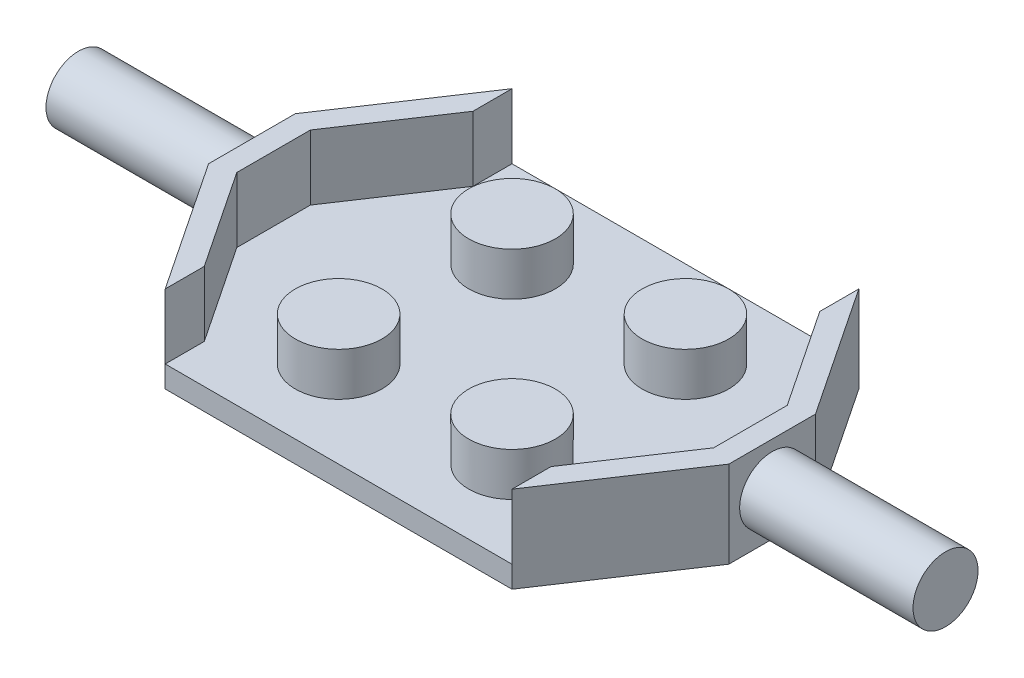
ISO-10303-21;
HEADER;
FILE_DESCRIPTION(('STEP AP214'),'2;1');
FILE_NAME('part.step','',(''),(''),'','','');
FILE_SCHEMA(('AUTOMOTIVE_DESIGN { 1 0 10303 214 1 1 1 1 }'));
ENDSEC;
DATA;
#1=APPLICATION_CONTEXT('core data for automotive mechanical design processes');
#2=APPLICATION_PROTOCOL_DEFINITION('international standard','automotive_design',2000,#1);
#3=PRODUCT_CONTEXT('',#1,'mechanical');
#4=PRODUCT('Part','Part','',(#3));
#5=PRODUCT_RELATED_PRODUCT_CATEGORY('part','',(#4));
#6=PRODUCT_DEFINITION_FORMATION('','',#4);
#7=PRODUCT_DEFINITION_CONTEXT('part definition',#1,'design');
#8=PRODUCT_DEFINITION('design','',#6,#7);
#9=PRODUCT_DEFINITION_SHAPE('','',#8);
#10=(LENGTH_UNIT() NAMED_UNIT(*) SI_UNIT(.MILLI.,.METRE.));
#11=(NAMED_UNIT(*) PLANE_ANGLE_UNIT() SI_UNIT($,.RADIAN.));
#12=(NAMED_UNIT(*) SI_UNIT($,.STERADIAN.) SOLID_ANGLE_UNIT());
#13=UNCERTAINTY_MEASURE_WITH_UNIT(LENGTH_MEASURE(1.E-05),#10,'distance_accuracy_value','');
#14=(GEOMETRIC_REPRESENTATION_CONTEXT(3) GLOBAL_UNCERTAINTY_ASSIGNED_CONTEXT((#13)) GLOBAL_UNIT_ASSIGNED_CONTEXT((#10,
#11,#12)) REPRESENTATION_CONTEXT('',''));
#15=CARTESIAN_POINT('',(0.,0.,0.));
#16=DIRECTION('',(0.,0.,1.));
#17=DIRECTION('',(1.,0.,0.));
#18=AXIS2_PLACEMENT_3D('',#15,#16,#17);
#19=CARTESIAN_POINT('',(0.,1.,0.));
#20=DIRECTION('',(0.,1.,0.));
#21=DIRECTION('',(0.,0.,1.));
#22=AXIS2_PLACEMENT_3D('',#19,#20,#21);
#23=PLANE('',#22);
#24=DIRECTION('',(0.,0.,-1.));
#25=VECTOR('',#24,1.);
#26=CARTESIAN_POINT('',(8.,1.,-8.));
#27=LINE('',#26,#25);
#28=CARTESIAN_POINT('',(8.,1.,-6.19722436226801));
#29=VERTEX_POINT('',#28);
#30=CARTESIAN_POINT('',(8.,1.,-8.));
#31=VERTEX_POINT('',#30);
#32=EDGE_CURVE('E389',#29,#31,#27,.T.);
#33=ORIENTED_EDGE('',*,*,#32,.T.);
#34=DIRECTION('',(1.,0.,0.));
#35=VECTOR('',#34,1.);
#36=CARTESIAN_POINT('',(0.,1.,-8.));
#37=LINE('',#36,#35);
#38=CARTESIAN_POINT('',(-8.,1.,-8.));
#39=VERTEX_POINT('',#38);
#40=EDGE_CURVE('E103',#39,#31,#37,.T.);
#41=ORIENTED_EDGE('',*,*,#40,.F.);
#42=DIRECTION('',(0.,0.,-1.));
#43=VECTOR('',#42,1.);
#44=CARTESIAN_POINT('',(-8.,1.,-8.));
#45=LINE('',#44,#43);
#46=CARTESIAN_POINT('',(-8.,1.,-6.19722436226801));
#47=VERTEX_POINT('',#46);
#48=EDGE_CURVE('E127',#47,#39,#45,.T.);
#49=ORIENTED_EDGE('',*,*,#48,.F.);
#50=DIRECTION('',(0.554700196225228,0.,-0.832050294337844));
#51=VECTOR('',#50,1.);
#52=CARTESIAN_POINT('',(-11.,1.,-1.697224362268));
#53=LINE('',#52,#51);
#54=CARTESIAN_POINT('',(-11.,1.,-1.697224362268));
#55=VERTEX_POINT('',#54);
#56=EDGE_CURVE('E157',#55,#47,#53,.T.);
#57=ORIENTED_EDGE('',*,*,#56,.F.);
#58=DIRECTION('',(0.,0.,-1.));
#59=VECTOR('',#58,1.);
#60=CARTESIAN_POINT('',(-11.,1.,1.69722436226801));
#61=LINE('',#60,#59);
#62=CARTESIAN_POINT('',(-11.,1.,1.69722436226801));
#63=VERTEX_POINT('',#62);
#64=EDGE_CURVE('E154',#63,#55,#61,.T.);
#65=ORIENTED_EDGE('',*,*,#64,.F.);
#66=DIRECTION('',(-0.554700196225229,0.,-0.832050294337844));
#67=VECTOR('',#66,1.);
#68=CARTESIAN_POINT('',(-11.,1.,1.69722436226801));
#69=LINE('',#68,#67);
#70=CARTESIAN_POINT('',(-8.,1.,6.19722436226801));
#71=VERTEX_POINT('',#70);
#72=EDGE_CURVE('E151',#71,#63,#69,.T.);
#73=ORIENTED_EDGE('',*,*,#72,.F.);
#74=DIRECTION('',(0.,0.,-1.));
#75=VECTOR('',#74,1.);
#76=CARTESIAN_POINT('',(-8.,1.,6.19722436226801));
#77=LINE('',#76,#75);
#78=CARTESIAN_POINT('',(-8.,1.,8.));
#79=VERTEX_POINT('',#78);
#80=EDGE_CURVE('E148',#79,#71,#77,.T.);
#81=ORIENTED_EDGE('',*,*,#80,.F.);
#82=DIRECTION('',(1.,0.,0.));
#83=VECTOR('',#82,1.);
#84=CARTESIAN_POINT('',(0.,1.,8.));
#85=LINE('',#84,#83);
#86=CARTESIAN_POINT('',(8.,1.,8.));
#87=VERTEX_POINT('',#86);
#88=EDGE_CURVE('E100',#79,#87,#85,.T.);
#89=ORIENTED_EDGE('',*,*,#88,.T.);
#90=DIRECTION('',(0.,0.,-1.));
#91=VECTOR('',#90,1.);
#92=CARTESIAN_POINT('',(8.,1.,6.19722436226801));
#93=LINE('',#92,#91);
#94=CARTESIAN_POINT('',(8.,1.,6.19722436226801));
#95=VERTEX_POINT('',#94);
#96=EDGE_CURVE('E367',#87,#95,#93,.T.);
#97=ORIENTED_EDGE('',*,*,#96,.T.);
#98=DIRECTION('',(0.554700196225229,0.,-0.832050294337844));
#99=VECTOR('',#98,1.);
#100=CARTESIAN_POINT('',(11.,1.,1.69722436226801));
#101=LINE('',#100,#99);
#102=CARTESIAN_POINT('',(11.,1.,1.69722436226801));
#103=VERTEX_POINT('',#102);
#104=EDGE_CURVE('E398',#95,#103,#101,.T.);
#105=ORIENTED_EDGE('',*,*,#104,.T.);
#106=DIRECTION('',(0.,0.,-1.));
#107=VECTOR('',#106,1.);
#108=CARTESIAN_POINT('',(11.,1.,1.69722436226801));
#109=LINE('',#108,#107);
#110=CARTESIAN_POINT('',(11.,1.,-1.697224362268));
#111=VERTEX_POINT('',#110);
#112=EDGE_CURVE('E395',#103,#111,#109,.T.);
#113=ORIENTED_EDGE('',*,*,#112,.T.);
#114=DIRECTION('',(-0.554700196225228,0.,-0.832050294337844));
#115=VECTOR('',#114,1.);
#116=CARTESIAN_POINT('',(11.,1.,-1.697224362268));
#117=LINE('',#116,#115);
#118=EDGE_CURVE('E391',#111,#29,#117,.T.);
#119=ORIENTED_EDGE('',*,*,#118,.T.);
#120=EDGE_LOOP('',(#33,#41,#49,#57,#65,#73,#81,#89,#97,#105,#113,#119));
#121=FACE_BOUND('',#120,.T.);
#122=CARTESIAN_POINT('',(4.,1.,4.));
#123=DIRECTION('',(0.,1.,0.));
#124=DIRECTION('',(0.,0.,1.));
#125=AXIS2_PLACEMENT_3D('',#122,#123,#124);
#126=CIRCLE('',#125,2.);
#127=CARTESIAN_POINT('',(4.,1.,6.));
#128=VERTEX_POINT('',#127);
#129=EDGE_CURVE('E11',#128,#128,#126,.T.);
#130=ORIENTED_EDGE('',*,*,#129,.F.);
#131=EDGE_LOOP('',(#130));
#132=FACE_BOUND('',#131,.T.);
#133=CARTESIAN_POINT('',(4.,1.,-4.));
#134=DIRECTION('',(0.,1.,0.));
#135=DIRECTION('',(0.,0.,1.));
#136=AXIS2_PLACEMENT_3D('',#133,#134,#135);
#137=CIRCLE('',#136,2.);
#138=CARTESIAN_POINT('',(4.,1.,-2.));
#139=VERTEX_POINT('',#138);
#140=EDGE_CURVE('E48',#139,#139,#137,.T.);
#141=ORIENTED_EDGE('',*,*,#140,.F.);
#142=EDGE_LOOP('',(#141));
#143=FACE_BOUND('',#142,.T.);
#144=CARTESIAN_POINT('',(-4.,1.,4.));
#145=DIRECTION('',(0.,1.,0.));
#146=DIRECTION('',(0.,0.,-1.));
#147=AXIS2_PLACEMENT_3D('',#144,#145,#146);
#148=CIRCLE('',#147,2.);
#149=CARTESIAN_POINT('',(-4.,1.,2.));
#150=VERTEX_POINT('',#149);
#151=EDGE_CURVE('E178',#150,#150,#148,.T.);
#152=ORIENTED_EDGE('',*,*,#151,.F.);
#153=EDGE_LOOP('',(#152));
#154=FACE_BOUND('',#153,.T.);
#155=CARTESIAN_POINT('',(-4.,1.,-4.));
#156=DIRECTION('',(0.,1.,0.));
#157=DIRECTION('',(0.,0.,1.));
#158=AXIS2_PLACEMENT_3D('',#155,#156,#157);
#159=CIRCLE('',#158,2.);
#160=CARTESIAN_POINT('',(-4.,1.,-2.));
#161=VERTEX_POINT('',#160);
#162=EDGE_CURVE('E181',#161,#161,#159,.T.);
#163=ORIENTED_EDGE('',*,*,#162,.F.);
#164=EDGE_LOOP('',(#163));
#165=FACE_BOUND('',#164,.T.);
#166=ADVANCED_FACE('F39',(#121,#132,#143,#154,#165),#23,.T.);
#167=CARTESIAN_POINT('',(-12.,1.,0.));
#168=DIRECTION('',(-1.,0.,0.));
#169=DIRECTION('',(0.,0.,1.));
#170=AXIS2_PLACEMENT_3D('',#167,#168,#169);
#171=PLANE('',#170);
#172=CARTESIAN_POINT('',(-12.,2.,0.));
#173=DIRECTION('',(-1.,0.,0.));
#174=DIRECTION('',(0.,0.,1.));
#175=AXIS2_PLACEMENT_3D('',#172,#173,#174);
#176=CIRCLE('',#175,1.5);
#177=CARTESIAN_POINT('',(-12.,2.,1.5));
#178=VERTEX_POINT('',#177);
#179=EDGE_CURVE('E111',#178,#178,#176,.T.);
#180=ORIENTED_EDGE('',*,*,#179,.F.);
#181=EDGE_LOOP('',(#180));
#182=FACE_BOUND('',#181,.T.);
#183=DIRECTION('',(0.,0.,-1.));
#184=VECTOR('',#183,1.);
#185=CARTESIAN_POINT('',(-12.,0.,0.));
#186=LINE('',#185,#184);
#187=CARTESIAN_POINT('',(-12.,0.,2.));
#188=VERTEX_POINT('',#187);
#189=CARTESIAN_POINT('',(-12.,0.,-2.));
#190=VERTEX_POINT('',#189);
#191=EDGE_CURVE('E99',#188,#190,#186,.T.);
#192=ORIENTED_EDGE('',*,*,#191,.F.);
#193=DIRECTION('',(0.,-1.,0.));
#194=VECTOR('',#193,1.);
#195=CARTESIAN_POINT('',(-12.,1.,2.));
#196=LINE('',#195,#194);
#197=CARTESIAN_POINT('',(-12.,4.,2.));
#198=VERTEX_POINT('',#197);
#199=EDGE_CURVE('E110',#198,#188,#196,.T.);
#200=ORIENTED_EDGE('',*,*,#199,.F.);
#201=DIRECTION('',(0.,0.,1.));
#202=VECTOR('',#201,1.);
#203=CARTESIAN_POINT('',(-12.,4.,2.));
#204=LINE('',#203,#202);
#205=CARTESIAN_POINT('',(-12.,4.,-2.));
#206=VERTEX_POINT('',#205);
#207=EDGE_CURVE('E123',#206,#198,#204,.T.);
#208=ORIENTED_EDGE('',*,*,#207,.F.);
#209=DIRECTION('',(0.,-1.,0.));
#210=VECTOR('',#209,1.);
#211=CARTESIAN_POINT('',(-12.,1.,-2.));
#212=LINE('',#211,#210);
#213=EDGE_CURVE('E81',#206,#190,#212,.T.);
#214=ORIENTED_EDGE('',*,*,#213,.T.);
#215=EDGE_LOOP('',(#192,#200,#208,#214));
#216=FACE_BOUND('',#215,.T.);
#217=ADVANCED_FACE('F41',(#182,#216),#171,.T.);
#218=CARTESIAN_POINT('',(-9.23076923076924,1.,6.15384615384615));
#219=DIRECTION('',(0.832050294337844,0.,-0.554700196225229));
#220=DIRECTION('',(-0.554700196225229,0.,-0.832050294337844));
#221=AXIS2_PLACEMENT_3D('',#218,#219,#220);
#222=PLANE('',#221);
#223=DIRECTION('',(0.554700196225229,0.,0.832050294337844));
#224=VECTOR('',#223,1.);
#225=CARTESIAN_POINT('',(-9.23076923076924,0.,6.15384615384615));
#226=LINE('',#225,#224);
#227=CARTESIAN_POINT('',(-8.,0.,8.));
#228=VERTEX_POINT('',#227);
#229=EDGE_CURVE('E191',#188,#228,#226,.T.);
#230=ORIENTED_EDGE('',*,*,#229,.T.);
#231=DIRECTION('',(0.,-1.,0.));
#232=VECTOR('',#231,1.);
#233=CARTESIAN_POINT('',(-8.,1.,8.));
#234=LINE('',#233,#232);
#235=EDGE_CURVE('E80',#79,#228,#234,.T.);
#236=ORIENTED_EDGE('',*,*,#235,.F.);
#237=DIRECTION('',(0.,-1.,0.));
#238=VECTOR('',#237,1.);
#239=CARTESIAN_POINT('',(-8.,4.,8.));
#240=LINE('',#239,#238);
#241=CARTESIAN_POINT('',(-8.,4.,8.));
#242=VERTEX_POINT('',#241);
#243=EDGE_CURVE('E174',#242,#79,#240,.T.);
#244=ORIENTED_EDGE('',*,*,#243,.F.);
#245=DIRECTION('',(0.554700196225229,0.,0.832050294337844));
#246=VECTOR('',#245,1.);
#247=CARTESIAN_POINT('',(-12.,4.,2.));
#248=LINE('',#247,#246);
#249=EDGE_CURVE('E126',#198,#242,#248,.T.);
#250=ORIENTED_EDGE('',*,*,#249,.F.);
#251=ORIENTED_EDGE('',*,*,#199,.T.);
#252=EDGE_LOOP('',(#230,#236,#244,#250,#251));
#253=FACE_BOUND('',#252,.T.);
#254=ADVANCED_FACE('F257',(#253),#222,.F.);
#255=CARTESIAN_POINT('',(0.,1.,8.));
#256=DIRECTION('',(0.,0.,-1.));
#257=DIRECTION('',(-1.,0.,0.));
#258=AXIS2_PLACEMENT_3D('',#255,#256,#257);
#259=PLANE('',#258);
#260=DIRECTION('',(1.,0.,0.));
#261=VECTOR('',#260,1.);
#262=CARTESIAN_POINT('',(0.,0.,8.));
#263=LINE('',#262,#261);
#264=CARTESIAN_POINT('',(8.,0.,8.));
#265=VERTEX_POINT('',#264);
#266=EDGE_CURVE('E93',#228,#265,#263,.T.);
#267=ORIENTED_EDGE('',*,*,#266,.T.);
#268=DIRECTION('',(0.,-1.,0.));
#269=VECTOR('',#268,1.);
#270=CARTESIAN_POINT('',(8.,1.,8.));
#271=LINE('',#270,#269);
#272=EDGE_CURVE('E201',#87,#265,#271,.T.);
#273=ORIENTED_EDGE('',*,*,#272,.F.);
#274=ORIENTED_EDGE('',*,*,#88,.F.);
#275=ORIENTED_EDGE('',*,*,#235,.T.);
#276=EDGE_LOOP('',(#267,#273,#274,#275));
#277=FACE_BOUND('',#276,.T.);
#278=ADVANCED_FACE('F198',(#277),#259,.F.);
#279=CARTESIAN_POINT('',(0.,1.,-8.));
#280=DIRECTION('',(0.,0.,-1.));
#281=DIRECTION('',(-1.,0.,0.));
#282=AXIS2_PLACEMENT_3D('',#279,#280,#281);
#283=PLANE('',#282);
#284=DIRECTION('',(1.,0.,0.));
#285=VECTOR('',#284,1.);
#286=CARTESIAN_POINT('',(0.,0.,-8.));
#287=LINE('',#286,#285);
#288=CARTESIAN_POINT('',(-8.,0.,-8.));
#289=VERTEX_POINT('',#288);
#290=CARTESIAN_POINT('',(8.,0.,-8.));
#291=VERTEX_POINT('',#290);
#292=EDGE_CURVE('E85',#289,#291,#287,.T.);
#293=ORIENTED_EDGE('',*,*,#292,.F.);
#294=DIRECTION('',(0.,-1.,0.));
#295=VECTOR('',#294,1.);
#296=CARTESIAN_POINT('',(-8.,1.,-8.));
#297=LINE('',#296,#295);
#298=EDGE_CURVE('E71',#39,#289,#297,.T.);
#299=ORIENTED_EDGE('',*,*,#298,.F.);
#300=ORIENTED_EDGE('',*,*,#40,.T.);
#301=DIRECTION('',(0.,-1.,0.));
#302=VECTOR('',#301,1.);
#303=CARTESIAN_POINT('',(8.,1.,-8.));
#304=LINE('',#303,#302);
#305=EDGE_CURVE('E89',#31,#291,#304,.T.);
#306=ORIENTED_EDGE('',*,*,#305,.T.);
#307=EDGE_LOOP('',(#293,#299,#300,#306));
#308=FACE_BOUND('',#307,.T.);
#309=ADVANCED_FACE('F86',(#308),#283,.T.);
#310=CARTESIAN_POINT('',(-9.23076923076924,1.,-6.15384615384615));
#311=DIRECTION('',(-0.832050294337844,0.,-0.554700196225229));
#312=DIRECTION('',(-0.554700196225229,0.,0.832050294337844));
#313=AXIS2_PLACEMENT_3D('',#310,#311,#312);
#314=PLANE('',#313);
#315=DIRECTION('',(0.554700196225229,0.,-0.832050294337844));
#316=VECTOR('',#315,1.);
#317=CARTESIAN_POINT('',(-9.23076923076924,0.,-6.15384615384615));
#318=LINE('',#317,#316);
#319=EDGE_CURVE('E76',#190,#289,#318,.T.);
#320=ORIENTED_EDGE('',*,*,#319,.F.);
#321=ORIENTED_EDGE('',*,*,#213,.F.);
#322=DIRECTION('',(-0.554700196225228,0.,0.832050294337844));
#323=VECTOR('',#322,1.);
#324=CARTESIAN_POINT('',(-12.,4.,-2.));
#325=LINE('',#324,#323);
#326=CARTESIAN_POINT('',(-8.,4.,-8.));
#327=VERTEX_POINT('',#326);
#328=EDGE_CURVE('E145',#327,#206,#325,.T.);
#329=ORIENTED_EDGE('',*,*,#328,.F.);
#330=DIRECTION('',(0.,-1.,0.));
#331=VECTOR('',#330,1.);
#332=CARTESIAN_POINT('',(-8.,4.,-8.));
#333=LINE('',#332,#331);
#334=EDGE_CURVE('E55',#327,#39,#333,.T.);
#335=ORIENTED_EDGE('',*,*,#334,.T.);
#336=ORIENTED_EDGE('',*,*,#298,.T.);
#337=EDGE_LOOP('',(#320,#321,#329,#335,#336));
#338=FACE_BOUND('',#337,.T.);
#339=ADVANCED_FACE('F73',(#338),#314,.T.);
#340=CARTESIAN_POINT('',(0.,0.,0.));
#341=DIRECTION('',(0.,1.,0.));
#342=DIRECTION('',(0.,0.,1.));
#343=AXIS2_PLACEMENT_3D('',#340,#341,#342);
#344=PLANE('',#343);
#345=ORIENTED_EDGE('',*,*,#191,.T.);
#346=ORIENTED_EDGE('',*,*,#319,.T.);
#347=ORIENTED_EDGE('',*,*,#292,.T.);
#348=DIRECTION('',(-0.554700196225229,0.,-0.832050294337844));
#349=VECTOR('',#348,1.);
#350=CARTESIAN_POINT('',(9.23076923076924,0.,-6.15384615384615));
#351=LINE('',#350,#349);
#352=CARTESIAN_POINT('',(12.,0.,-2.));
#353=VERTEX_POINT('',#352);
#354=EDGE_CURVE('E220',#353,#291,#351,.T.);
#355=ORIENTED_EDGE('',*,*,#354,.F.);
#356=DIRECTION('',(0.,0.,-1.));
#357=VECTOR('',#356,1.);
#358=CARTESIAN_POINT('',(12.,0.,0.));
#359=LINE('',#358,#357);
#360=CARTESIAN_POINT('',(12.,0.,2.));
#361=VERTEX_POINT('',#360);
#362=EDGE_CURVE('E219',#361,#353,#359,.T.);
#363=ORIENTED_EDGE('',*,*,#362,.F.);
#364=DIRECTION('',(-0.554700196225229,0.,0.832050294337844));
#365=VECTOR('',#364,1.);
#366=CARTESIAN_POINT('',(9.23076923076924,0.,6.15384615384615));
#367=LINE('',#366,#365);
#368=EDGE_CURVE('E211',#361,#265,#367,.T.);
#369=ORIENTED_EDGE('',*,*,#368,.T.);
#370=ORIENTED_EDGE('',*,*,#266,.F.);
#371=ORIENTED_EDGE('',*,*,#229,.F.);
#372=EDGE_LOOP('',(#345,#346,#347,#355,#363,#369,#370,#371));
#373=FACE_BOUND('',#372,.T.);
#374=ADVANCED_FACE('F96',(#373),#344,.F.);
#375=CARTESIAN_POINT('',(-4.,3.,-4.));
#376=DIRECTION('',(0.,-1.,0.));
#377=DIRECTION('',(0.,0.,-1.));
#378=AXIS2_PLACEMENT_3D('',#375,#376,#377);
#379=CYLINDRICAL_SURFACE('',#378,2.);
#380=CARTESIAN_POINT('',(-4.,3.,-4.));
#381=DIRECTION('',(0.,1.,0.));
#382=DIRECTION('',(0.,0.,1.));
#383=AXIS2_PLACEMENT_3D('',#380,#381,#382);
#384=CIRCLE('',#383,2.);
#385=CARTESIAN_POINT('',(-4.,3.,-2.));
#386=VERTEX_POINT('',#385);
#387=EDGE_CURVE('E184',#386,#386,#384,.T.);
#388=ORIENTED_EDGE('',*,*,#387,.F.);
#389=EDGE_LOOP('',(#388));
#390=FACE_BOUND('',#389,.T.);
#391=ORIENTED_EDGE('',*,*,#162,.T.);
#392=EDGE_LOOP('',(#391));
#393=FACE_BOUND('',#392,.T.);
#394=ADVANCED_FACE('F263',(#390,#393),#379,.T.);
#395=CARTESIAN_POINT('',(-4.,3.,-4.));
#396=DIRECTION('',(0.,1.,0.));
#397=DIRECTION('',(0.,0.,1.));
#398=AXIS2_PLACEMENT_3D('',#395,#396,#397);
#399=PLANE('',#398);
#400=ORIENTED_EDGE('',*,*,#387,.T.);
#401=EDGE_LOOP('',(#400));
#402=FACE_BOUND('',#401,.T.);
#403=ADVANCED_FACE('F497',(#402),#399,.T.);
#404=CARTESIAN_POINT('',(-4.,3.,4.));
#405=DIRECTION('',(0.,-1.,0.));
#406=DIRECTION('',(0.,0.,-1.));
#407=AXIS2_PLACEMENT_3D('',#404,#405,#406);
#408=CYLINDRICAL_SURFACE('',#407,2.);
#409=CARTESIAN_POINT('',(-4.,3.,4.));
#410=DIRECTION('',(0.,1.,0.));
#411=DIRECTION('',(0.,0.,-1.));
#412=AXIS2_PLACEMENT_3D('',#409,#410,#411);
#413=CIRCLE('',#412,2.);
#414=CARTESIAN_POINT('',(-4.,3.,2.));
#415=VERTEX_POINT('',#414);
#416=EDGE_CURVE('E177',#415,#415,#413,.T.);
#417=ORIENTED_EDGE('',*,*,#416,.F.);
#418=EDGE_LOOP('',(#417));
#419=FACE_BOUND('',#418,.T.);
#420=ORIENTED_EDGE('',*,*,#151,.T.);
#421=EDGE_LOOP('',(#420));
#422=FACE_BOUND('',#421,.T.);
#423=ADVANCED_FACE('F502',(#419,#422),#408,.T.);
#424=CARTESIAN_POINT('',(-4.,3.,4.));
#425=DIRECTION('',(0.,-1.,0.));
#426=DIRECTION('',(0.,0.,-1.));
#427=AXIS2_PLACEMENT_3D('',#424,#425,#426);
#428=PLANE('',#427);
#429=ORIENTED_EDGE('',*,*,#416,.T.);
#430=EDGE_LOOP('',(#429));
#431=FACE_BOUND('',#430,.T.);
#432=ADVANCED_FACE('F508',(#431),#428,.F.);
#433=CARTESIAN_POINT('',(-8.,4.,6.19722436226801));
#434=DIRECTION('',(-1.,0.,0.));
#435=DIRECTION('',(0.,0.,1.));
#436=AXIS2_PLACEMENT_3D('',#433,#434,#435);
#437=PLANE('',#436);
#438=ORIENTED_EDGE('',*,*,#80,.T.);
#439=DIRECTION('',(0.,-1.,0.));
#440=VECTOR('',#439,1.);
#441=CARTESIAN_POINT('',(-8.,4.,6.19722436226801));
#442=LINE('',#441,#440);
#443=CARTESIAN_POINT('',(-8.,4.,6.19722436226801));
#444=VERTEX_POINT('',#443);
#445=EDGE_CURVE('E171',#444,#71,#442,.T.);
#446=ORIENTED_EDGE('',*,*,#445,.F.);
#447=DIRECTION('',(0.,0.,-1.));
#448=VECTOR('',#447,1.);
#449=CARTESIAN_POINT('',(-8.,4.,6.19722436226801));
#450=LINE('',#449,#448);
#451=EDGE_CURVE('E130',#242,#444,#450,.T.);
#452=ORIENTED_EDGE('',*,*,#451,.F.);
#453=ORIENTED_EDGE('',*,*,#243,.T.);
#454=EDGE_LOOP('',(#438,#446,#452,#453));
#455=FACE_BOUND('',#454,.T.);
#456=ADVANCED_FACE('F513',(#455),#437,.F.);
#457=CARTESIAN_POINT('',(-11.,4.,1.69722436226801));
#458=DIRECTION('',(-0.832050294337844,0.,0.554700196225229));
#459=DIRECTION('',(0.554700196225229,0.,0.832050294337844));
#460=AXIS2_PLACEMENT_3D('',#457,#458,#459);
#461=PLANE('',#460);
#462=ORIENTED_EDGE('',*,*,#72,.T.);
#463=DIRECTION('',(0.,-1.,0.));
#464=VECTOR('',#463,1.);
#465=CARTESIAN_POINT('',(-11.,4.,1.69722436226801));
#466=LINE('',#465,#464);
#467=CARTESIAN_POINT('',(-11.,4.,1.69722436226801));
#468=VERTEX_POINT('',#467);
#469=EDGE_CURVE('E168',#468,#63,#466,.T.);
#470=ORIENTED_EDGE('',*,*,#469,.F.);
#471=DIRECTION('',(-0.554700196225229,0.,-0.832050294337844));
#472=VECTOR('',#471,1.);
#473=CARTESIAN_POINT('',(-11.,4.,1.69722436226801));
#474=LINE('',#473,#472);
#475=EDGE_CURVE('E133',#444,#468,#474,.T.);
#476=ORIENTED_EDGE('',*,*,#475,.F.);
#477=ORIENTED_EDGE('',*,*,#445,.T.);
#478=EDGE_LOOP('',(#462,#470,#476,#477));
#479=FACE_BOUND('',#478,.T.);
#480=ADVANCED_FACE('F518',(#479),#461,.F.);
#481=CARTESIAN_POINT('',(-11.,4.,1.69722436226801));
#482=DIRECTION('',(-1.,0.,0.));
#483=DIRECTION('',(0.,0.,1.));
#484=AXIS2_PLACEMENT_3D('',#481,#482,#483);
#485=PLANE('',#484);
#486=ORIENTED_EDGE('',*,*,#64,.T.);
#487=DIRECTION('',(0.,-1.,0.));
#488=VECTOR('',#487,1.);
#489=CARTESIAN_POINT('',(-11.,4.,-1.697224362268));
#490=LINE('',#489,#488);
#491=CARTESIAN_POINT('',(-11.,4.,-1.697224362268));
#492=VERTEX_POINT('',#491);
#493=EDGE_CURVE('E165',#492,#55,#490,.T.);
#494=ORIENTED_EDGE('',*,*,#493,.F.);
#495=DIRECTION('',(0.,0.,-1.));
#496=VECTOR('',#495,1.);
#497=CARTESIAN_POINT('',(-11.,4.,1.69722436226801));
#498=LINE('',#497,#496);
#499=EDGE_CURVE('E136',#468,#492,#498,.T.);
#500=ORIENTED_EDGE('',*,*,#499,.F.);
#501=ORIENTED_EDGE('',*,*,#469,.T.);
#502=EDGE_LOOP('',(#486,#494,#500,#501));
#503=FACE_BOUND('',#502,.T.);
#504=ADVANCED_FACE('F522',(#503),#485,.F.);
#505=CARTESIAN_POINT('',(-11.,4.,-1.697224362268));
#506=DIRECTION('',(-0.832050294337844,0.,-0.554700196225228));
#507=DIRECTION('',(-0.554700196225228,0.,0.832050294337844));
#508=AXIS2_PLACEMENT_3D('',#505,#506,#507);
#509=PLANE('',#508);
#510=ORIENTED_EDGE('',*,*,#56,.T.);
#511=DIRECTION('',(0.,-1.,0.));
#512=VECTOR('',#511,1.);
#513=CARTESIAN_POINT('',(-8.,4.,-6.19722436226801));
#514=LINE('',#513,#512);
#515=CARTESIAN_POINT('',(-8.,4.,-6.19722436226801));
#516=VERTEX_POINT('',#515);
#517=EDGE_CURVE('E162',#516,#47,#514,.T.);
#518=ORIENTED_EDGE('',*,*,#517,.F.);
#519=DIRECTION('',(0.554700196225228,0.,-0.832050294337844));
#520=VECTOR('',#519,1.);
#521=CARTESIAN_POINT('',(-11.,4.,-1.697224362268));
#522=LINE('',#521,#520);
#523=EDGE_CURVE('E139',#492,#516,#522,.T.);
#524=ORIENTED_EDGE('',*,*,#523,.F.);
#525=ORIENTED_EDGE('',*,*,#493,.T.);
#526=EDGE_LOOP('',(#510,#518,#524,#525));
#527=FACE_BOUND('',#526,.T.);
#528=ADVANCED_FACE('F526',(#527),#509,.F.);
#529=CARTESIAN_POINT('',(-8.,4.,-8.));
#530=DIRECTION('',(-1.,0.,0.));
#531=DIRECTION('',(0.,0.,1.));
#532=AXIS2_PLACEMENT_3D('',#529,#530,#531);
#533=PLANE('',#532);
#534=ORIENTED_EDGE('',*,*,#48,.T.);
#535=ORIENTED_EDGE('',*,*,#334,.F.);
#536=DIRECTION('',(0.,0.,-1.));
#537=VECTOR('',#536,1.);
#538=CARTESIAN_POINT('',(-8.,4.,-8.));
#539=LINE('',#538,#537);
#540=EDGE_CURVE('E142',#516,#327,#539,.T.);
#541=ORIENTED_EDGE('',*,*,#540,.F.);
#542=ORIENTED_EDGE('',*,*,#517,.T.);
#543=EDGE_LOOP('',(#534,#535,#541,#542));
#544=FACE_BOUND('',#543,.T.);
#545=ADVANCED_FACE('F248',(#544),#533,.F.);
#546=CARTESIAN_POINT('',(0.,4.,0.));
#547=DIRECTION('',(0.,-1.,0.));
#548=DIRECTION('',(0.,0.,-1.));
#549=AXIS2_PLACEMENT_3D('',#546,#547,#548);
#550=PLANE('',#549);
#551=ORIENTED_EDGE('',*,*,#207,.T.);
#552=ORIENTED_EDGE('',*,*,#249,.T.);
#553=ORIENTED_EDGE('',*,*,#451,.T.);
#554=ORIENTED_EDGE('',*,*,#475,.T.);
#555=ORIENTED_EDGE('',*,*,#499,.T.);
#556=ORIENTED_EDGE('',*,*,#523,.T.);
#557=ORIENTED_EDGE('',*,*,#540,.T.);
#558=ORIENTED_EDGE('',*,*,#328,.T.);
#559=EDGE_LOOP('',(#551,#552,#553,#554,#555,#556,#557,#558));
#560=FACE_BOUND('',#559,.T.);
#561=ADVANCED_FACE('F240',(#560),#550,.F.);
#562=CARTESIAN_POINT('',(-20.,2.,0.));
#563=DIRECTION('',(1.,0.,0.));
#564=DIRECTION('',(0.,0.,-1.));
#565=AXIS2_PLACEMENT_3D('',#562,#563,#564);
#566=CYLINDRICAL_SURFACE('',#565,1.5);
#567=CARTESIAN_POINT('',(-20.,2.,0.));
#568=DIRECTION('',(-1.,0.,0.));
#569=DIRECTION('',(0.,0.,1.));
#570=AXIS2_PLACEMENT_3D('',#567,#568,#569);
#571=CIRCLE('',#570,1.5);
#572=CARTESIAN_POINT('',(-20.,2.,1.5));
#573=VERTEX_POINT('',#572);
#574=EDGE_CURVE('E121',#573,#573,#571,.T.);
#575=ORIENTED_EDGE('',*,*,#574,.F.);
#576=EDGE_LOOP('',(#575));
#577=FACE_BOUND('',#576,.T.);
#578=ORIENTED_EDGE('',*,*,#179,.T.);
#579=EDGE_LOOP('',(#578));
#580=FACE_BOUND('',#579,.T.);
#581=ADVANCED_FACE('F238',(#577,#580),#566,.T.);
#582=CARTESIAN_POINT('',(-20.,2.,0.));
#583=DIRECTION('',(-1.,0.,0.));
#584=DIRECTION('',(0.,0.,1.));
#585=AXIS2_PLACEMENT_3D('',#582,#583,#584);
#586=PLANE('',#585);
#587=ORIENTED_EDGE('',*,*,#574,.T.);
#588=EDGE_LOOP('',(#587));
#589=FACE_BOUND('',#588,.T.);
#590=ADVANCED_FACE('F236',(#589),#586,.T.);
#591=CARTESIAN_POINT('',(12.,1.,0.));
#592=DIRECTION('',(-1.,0.,0.));
#593=DIRECTION('',(0.,0.,1.));
#594=AXIS2_PLACEMENT_3D('',#591,#592,#593);
#595=PLANE('',#594);
#596=CARTESIAN_POINT('',(12.,2.,0.));
#597=DIRECTION('',(-1.,0.,0.));
#598=DIRECTION('',(0.,0.,1.));
#599=AXIS2_PLACEMENT_3D('',#596,#597,#598);
#600=CIRCLE('',#599,1.5);
#601=CARTESIAN_POINT('',(12.,2.,1.5));
#602=VERTEX_POINT('',#601);
#603=EDGE_CURVE('E446',#602,#602,#600,.T.);
#604=ORIENTED_EDGE('',*,*,#603,.T.);
#605=EDGE_LOOP('',(#604));
#606=FACE_BOUND('',#605,.T.);
#607=ORIENTED_EDGE('',*,*,#362,.T.);
#608=DIRECTION('',(0.,-1.,0.));
#609=VECTOR('',#608,1.);
#610=CARTESIAN_POINT('',(12.,1.,-2.));
#611=LINE('',#610,#609);
#612=CARTESIAN_POINT('',(12.,4.,-2.));
#613=VERTEX_POINT('',#612);
#614=EDGE_CURVE('E227',#613,#353,#611,.T.);
#615=ORIENTED_EDGE('',*,*,#614,.F.);
#616=DIRECTION('',(0.,0.,1.));
#617=VECTOR('',#616,1.);
#618=CARTESIAN_POINT('',(12.,4.,2.));
#619=LINE('',#618,#617);
#620=CARTESIAN_POINT('',(12.,4.,2.));
#621=VERTEX_POINT('',#620);
#622=EDGE_CURVE('E357',#613,#621,#619,.T.);
#623=ORIENTED_EDGE('',*,*,#622,.T.);
#624=DIRECTION('',(0.,-1.,0.));
#625=VECTOR('',#624,1.);
#626=CARTESIAN_POINT('',(12.,1.,2.));
#627=LINE('',#626,#625);
#628=EDGE_CURVE('E215',#621,#361,#627,.T.);
#629=ORIENTED_EDGE('',*,*,#628,.T.);
#630=EDGE_LOOP('',(#607,#615,#623,#629));
#631=FACE_BOUND('',#630,.T.);
#632=ADVANCED_FACE('F246',(#606,#631),#595,.F.);
#633=CARTESIAN_POINT('',(9.23076923076924,1.,-6.15384615384615));
#634=DIRECTION('',(-0.832050294337844,0.,0.554700196225229));
#635=DIRECTION('',(0.554700196225229,0.,0.832050294337844));
#636=AXIS2_PLACEMENT_3D('',#633,#634,#635);
#637=PLANE('',#636);
#638=ORIENTED_EDGE('',*,*,#354,.T.);
#639=ORIENTED_EDGE('',*,*,#305,.F.);
#640=DIRECTION('',(0.,-1.,0.));
#641=VECTOR('',#640,1.);
#642=CARTESIAN_POINT('',(8.,4.,-8.));
#643=LINE('',#642,#641);
#644=CARTESIAN_POINT('',(8.,4.,-8.));
#645=VERTEX_POINT('',#644);
#646=EDGE_CURVE('E370',#645,#31,#643,.T.);
#647=ORIENTED_EDGE('',*,*,#646,.F.);
#648=DIRECTION('',(0.554700196225228,0.,0.832050294337844));
#649=VECTOR('',#648,1.);
#650=CARTESIAN_POINT('',(12.,4.,-2.));
#651=LINE('',#650,#649);
#652=EDGE_CURVE('E363',#645,#613,#651,.T.);
#653=ORIENTED_EDGE('',*,*,#652,.T.);
#654=ORIENTED_EDGE('',*,*,#614,.T.);
#655=EDGE_LOOP('',(#638,#639,#647,#653,#654));
#656=FACE_BOUND('',#655,.T.);
#657=ADVANCED_FACE('F369',(#656),#637,.F.);
#658=CARTESIAN_POINT('',(9.23076923076924,1.,6.15384615384615));
#659=DIRECTION('',(0.832050294337844,0.,0.554700196225229));
#660=DIRECTION('',(0.554700196225229,0.,-0.832050294337844));
#661=AXIS2_PLACEMENT_3D('',#658,#659,#660);
#662=PLANE('',#661);
#663=ORIENTED_EDGE('',*,*,#368,.F.);
#664=ORIENTED_EDGE('',*,*,#628,.F.);
#665=DIRECTION('',(-0.554700196225229,0.,0.832050294337844));
#666=VECTOR('',#665,1.);
#667=CARTESIAN_POINT('',(12.,4.,2.));
#668=LINE('',#667,#666);
#669=CARTESIAN_POINT('',(8.,4.,8.));
#670=VERTEX_POINT('',#669);
#671=EDGE_CURVE('E366',#621,#670,#668,.T.);
#672=ORIENTED_EDGE('',*,*,#671,.T.);
#673=DIRECTION('',(0.,-1.,0.));
#674=VECTOR('',#673,1.);
#675=CARTESIAN_POINT('',(8.,4.,8.));
#676=LINE('',#675,#674);
#677=EDGE_CURVE('E214',#670,#87,#676,.T.);
#678=ORIENTED_EDGE('',*,*,#677,.T.);
#679=ORIENTED_EDGE('',*,*,#272,.T.);
#680=EDGE_LOOP('',(#663,#664,#672,#678,#679));
#681=FACE_BOUND('',#680,.T.);
#682=ADVANCED_FACE('F209',(#681),#662,.T.);
#683=CARTESIAN_POINT('',(4.,3.,-4.));
#684=DIRECTION('',(0.,-1.,0.));
#685=DIRECTION('',(0.,0.,-1.));
#686=AXIS2_PLACEMENT_3D('',#683,#684,#685);
#687=CYLINDRICAL_SURFACE('',#686,2.);
#688=CARTESIAN_POINT('',(4.,3.,-4.));
#689=DIRECTION('',(0.,-1.,0.));
#690=DIRECTION('',(0.,0.,1.));
#691=AXIS2_PLACEMENT_3D('',#688,#689,#690);
#692=CIRCLE('',#691,2.);
#693=CARTESIAN_POINT('',(4.,3.,-2.));
#694=VERTEX_POINT('',#693);
#695=EDGE_CURVE('E416',#694,#694,#692,.T.);
#696=ORIENTED_EDGE('',*,*,#695,.T.);
#697=EDGE_LOOP('',(#696));
#698=FACE_BOUND('',#697,.T.);
#699=ORIENTED_EDGE('',*,*,#140,.T.);
#700=EDGE_LOOP('',(#699));
#701=FACE_BOUND('',#700,.T.);
#702=ADVANCED_FACE('F420',(#698,#701),#687,.T.);
#703=CARTESIAN_POINT('',(4.,3.,-4.));
#704=DIRECTION('',(0.,1.,0.));
#705=DIRECTION('',(0.,0.,1.));
#706=AXIS2_PLACEMENT_3D('',#703,#704,#705);
#707=PLANE('',#706);
#708=ORIENTED_EDGE('',*,*,#695,.F.);
#709=EDGE_LOOP('',(#708));
#710=FACE_BOUND('',#709,.T.);
#711=ADVANCED_FACE('F422',(#710),#707,.T.);
#712=CARTESIAN_POINT('',(4.,3.,4.));
#713=DIRECTION('',(0.,-1.,0.));
#714=DIRECTION('',(0.,0.,-1.));
#715=AXIS2_PLACEMENT_3D('',#712,#713,#714);
#716=CYLINDRICAL_SURFACE('',#715,2.);
#717=CARTESIAN_POINT('',(4.,3.,4.));
#718=DIRECTION('',(0.,-1.,0.));
#719=DIRECTION('',(0.,0.,-1.));
#720=AXIS2_PLACEMENT_3D('',#717,#718,#719);
#721=CIRCLE('',#720,2.);
#722=CARTESIAN_POINT('',(4.,3.,2.));
#723=VERTEX_POINT('',#722);
#724=EDGE_CURVE('E413',#723,#723,#721,.T.);
#725=ORIENTED_EDGE('',*,*,#724,.T.);
#726=EDGE_LOOP('',(#725));
#727=FACE_BOUND('',#726,.T.);
#728=ORIENTED_EDGE('',*,*,#129,.T.);
#729=EDGE_LOOP('',(#728));
#730=FACE_BOUND('',#729,.T.);
#731=ADVANCED_FACE('F424',(#727,#730),#716,.T.);
#732=CARTESIAN_POINT('',(4.,3.,4.));
#733=DIRECTION('',(0.,-1.,0.));
#734=DIRECTION('',(0.,0.,-1.));
#735=AXIS2_PLACEMENT_3D('',#732,#733,#734);
#736=PLANE('',#735);
#737=ORIENTED_EDGE('',*,*,#724,.F.);
#738=EDGE_LOOP('',(#737));
#739=FACE_BOUND('',#738,.T.);
#740=ADVANCED_FACE('F430',(#739),#736,.F.);
#741=CARTESIAN_POINT('',(8.,4.,-8.));
#742=DIRECTION('',(-1.,0.,0.));
#743=DIRECTION('',(0.,0.,1.));
#744=AXIS2_PLACEMENT_3D('',#741,#742,#743);
#745=PLANE('',#744);
#746=ORIENTED_EDGE('',*,*,#32,.F.);
#747=DIRECTION('',(0.,-1.,0.));
#748=VECTOR('',#747,1.);
#749=CARTESIAN_POINT('',(8.,4.,-6.19722436226801));
#750=LINE('',#749,#748);
#751=CARTESIAN_POINT('',(8.,4.,-6.19722436226801));
#752=VERTEX_POINT('',#751);
#753=EDGE_CURVE('E410',#752,#29,#750,.T.);
#754=ORIENTED_EDGE('',*,*,#753,.F.);
#755=DIRECTION('',(0.,0.,-1.));
#756=VECTOR('',#755,1.);
#757=CARTESIAN_POINT('',(8.,4.,-8.));
#758=LINE('',#757,#756);
#759=EDGE_CURVE('E371',#752,#645,#758,.T.);
#760=ORIENTED_EDGE('',*,*,#759,.T.);
#761=ORIENTED_EDGE('',*,*,#646,.T.);
#762=EDGE_LOOP('',(#746,#754,#760,#761));
#763=FACE_BOUND('',#762,.T.);
#764=ADVANCED_FACE('F479',(#763),#745,.T.);
#765=CARTESIAN_POINT('',(11.,4.,-1.697224362268));
#766=DIRECTION('',(-0.832050294337844,0.,0.554700196225228));
#767=DIRECTION('',(0.554700196225228,0.,0.832050294337844));
#768=AXIS2_PLACEMENT_3D('',#765,#766,#767);
#769=PLANE('',#768);
#770=ORIENTED_EDGE('',*,*,#118,.F.);
#771=DIRECTION('',(0.,-1.,0.));
#772=VECTOR('',#771,1.);
#773=CARTESIAN_POINT('',(11.,4.,-1.697224362268));
#774=LINE('',#773,#772);
#775=CARTESIAN_POINT('',(11.,4.,-1.697224362268));
#776=VERTEX_POINT('',#775);
#777=EDGE_CURVE('E408',#776,#111,#774,.T.);
#778=ORIENTED_EDGE('',*,*,#777,.F.);
#779=DIRECTION('',(-0.554700196225228,0.,-0.832050294337844));
#780=VECTOR('',#779,1.);
#781=CARTESIAN_POINT('',(11.,4.,-1.697224362268));
#782=LINE('',#781,#780);
#783=EDGE_CURVE('E373',#776,#752,#782,.T.);
#784=ORIENTED_EDGE('',*,*,#783,.T.);
#785=ORIENTED_EDGE('',*,*,#753,.T.);
#786=EDGE_LOOP('',(#770,#778,#784,#785));
#787=FACE_BOUND('',#786,.T.);
#788=ADVANCED_FACE('F475',(#787),#769,.T.);
#789=CARTESIAN_POINT('',(11.,4.,1.69722436226801));
#790=DIRECTION('',(-1.,0.,0.));
#791=DIRECTION('',(0.,0.,1.));
#792=AXIS2_PLACEMENT_3D('',#789,#790,#791);
#793=PLANE('',#792);
#794=ORIENTED_EDGE('',*,*,#112,.F.);
#795=DIRECTION('',(0.,-1.,0.));
#796=VECTOR('',#795,1.);
#797=CARTESIAN_POINT('',(11.,4.,1.69722436226801));
#798=LINE('',#797,#796);
#799=CARTESIAN_POINT('',(11.,4.,1.69722436226801));
#800=VERTEX_POINT('',#799);
#801=EDGE_CURVE('E406',#800,#103,#798,.T.);
#802=ORIENTED_EDGE('',*,*,#801,.F.);
#803=DIRECTION('',(0.,0.,-1.));
#804=VECTOR('',#803,1.);
#805=CARTESIAN_POINT('',(11.,4.,1.69722436226801));
#806=LINE('',#805,#804);
#807=EDGE_CURVE('E379',#800,#776,#806,.T.);
#808=ORIENTED_EDGE('',*,*,#807,.T.);
#809=ORIENTED_EDGE('',*,*,#777,.T.);
#810=EDGE_LOOP('',(#794,#802,#808,#809));
#811=FACE_BOUND('',#810,.T.);
#812=ADVANCED_FACE('F471',(#811),#793,.T.);
#813=CARTESIAN_POINT('',(11.,4.,1.69722436226801));
#814=DIRECTION('',(-0.832050294337844,0.,-0.554700196225229));
#815=DIRECTION('',(-0.554700196225229,0.,0.832050294337844));
#816=AXIS2_PLACEMENT_3D('',#813,#814,#815);
#817=PLANE('',#816);
#818=ORIENTED_EDGE('',*,*,#104,.F.);
#819=DIRECTION('',(0.,-1.,0.));
#820=VECTOR('',#819,1.);
#821=CARTESIAN_POINT('',(8.,4.,6.19722436226801));
#822=LINE('',#821,#820);
#823=CARTESIAN_POINT('',(8.,4.,6.19722436226801));
#824=VERTEX_POINT('',#823);
#825=EDGE_CURVE('E404',#824,#95,#822,.T.);
#826=ORIENTED_EDGE('',*,*,#825,.F.);
#827=DIRECTION('',(0.554700196225229,0.,-0.832050294337844));
#828=VECTOR('',#827,1.);
#829=CARTESIAN_POINT('',(11.,4.,1.69722436226801));
#830=LINE('',#829,#828);
#831=EDGE_CURVE('E382',#824,#800,#830,.T.);
#832=ORIENTED_EDGE('',*,*,#831,.T.);
#833=ORIENTED_EDGE('',*,*,#801,.T.);
#834=EDGE_LOOP('',(#818,#826,#832,#833));
#835=FACE_BOUND('',#834,.T.);
#836=ADVANCED_FACE('F467',(#835),#817,.T.);
#837=CARTESIAN_POINT('',(8.,4.,6.19722436226801));
#838=DIRECTION('',(-1.,0.,0.));
#839=DIRECTION('',(0.,0.,1.));
#840=AXIS2_PLACEMENT_3D('',#837,#838,#839);
#841=PLANE('',#840);
#842=ORIENTED_EDGE('',*,*,#96,.F.);
#843=ORIENTED_EDGE('',*,*,#677,.F.);
#844=DIRECTION('',(0.,0.,-1.));
#845=VECTOR('',#844,1.);
#846=CARTESIAN_POINT('',(8.,4.,6.19722436226801));
#847=LINE('',#846,#845);
#848=EDGE_CURVE('E385',#670,#824,#847,.T.);
#849=ORIENTED_EDGE('',*,*,#848,.T.);
#850=ORIENTED_EDGE('',*,*,#825,.T.);
#851=EDGE_LOOP('',(#842,#843,#849,#850));
#852=FACE_BOUND('',#851,.T.);
#853=ADVANCED_FACE('F464',(#852),#841,.T.);
#854=CARTESIAN_POINT('',(0.,4.,0.));
#855=DIRECTION('',(0.,-1.,0.));
#856=DIRECTION('',(0.,0.,-1.));
#857=AXIS2_PLACEMENT_3D('',#854,#855,#856);
#858=PLANE('',#857);
#859=ORIENTED_EDGE('',*,*,#622,.F.);
#860=ORIENTED_EDGE('',*,*,#652,.F.);
#861=ORIENTED_EDGE('',*,*,#759,.F.);
#862=ORIENTED_EDGE('',*,*,#783,.F.);
#863=ORIENTED_EDGE('',*,*,#807,.F.);
#864=ORIENTED_EDGE('',*,*,#831,.F.);
#865=ORIENTED_EDGE('',*,*,#848,.F.);
#866=ORIENTED_EDGE('',*,*,#671,.F.);
#867=EDGE_LOOP('',(#859,#860,#861,#862,#863,#864,#865,#866));
#868=FACE_BOUND('',#867,.T.);
#869=ADVANCED_FACE('F361',(#868),#858,.F.);
#870=CARTESIAN_POINT('',(20.,2.,0.));
#871=DIRECTION('',(-1.,0.,0.));
#872=DIRECTION('',(0.,0.,1.));
#873=AXIS2_PLACEMENT_3D('',#870,#871,#872);
#874=CYLINDRICAL_SURFACE('',#873,1.5);
#875=CARTESIAN_POINT('',(20.,2.,0.));
#876=DIRECTION('',(-1.,0.,0.));
#877=DIRECTION('',(0.,0.,1.));
#878=AXIS2_PLACEMENT_3D('',#875,#876,#877);
#879=CIRCLE('',#878,1.5);
#880=CARTESIAN_POINT('',(20.,2.,1.5));
#881=VERTEX_POINT('',#880);
#882=EDGE_CURVE('E392',#881,#881,#879,.T.);
#883=ORIENTED_EDGE('',*,*,#882,.T.);
#884=EDGE_LOOP('',(#883));
#885=FACE_BOUND('',#884,.T.);
#886=ORIENTED_EDGE('',*,*,#603,.F.);
#887=EDGE_LOOP('',(#886));
#888=FACE_BOUND('',#887,.T.);
#889=ADVANCED_FACE('F452',(#885,#888),#874,.T.);
#890=CARTESIAN_POINT('',(20.,2.,0.));
#891=DIRECTION('',(1.,0.,0.));
#892=DIRECTION('',(0.,0.,1.));
#893=AXIS2_PLACEMENT_3D('',#890,#891,#892);
#894=PLANE('',#893);
#895=ORIENTED_EDGE('',*,*,#882,.F.);
#896=EDGE_LOOP('',(#895));
#897=FACE_BOUND('',#896,.T.);
#898=ADVANCED_FACE('F454',(#897),#894,.T.);
#899=CLOSED_SHELL('',(#166,#217,#254,#278,#309,#339,#374,#394,#403,#423,#432,#456,#480,#504,
#528,#545,#561,#581,#590,#632,#657,#682,#702,#711,#731,#740,#764,#788,#812,#836,#853,#869,#889,#898));
#900=MANIFOLD_SOLID_BREP('B2',#899);
#901=ADVANCED_BREP_SHAPE_REPRESENTATION('',(#18,#900),#14);
#902=SHAPE_DEFINITION_REPRESENTATION(#9,#901);
ENDSEC;
END-ISO-10303-21;
